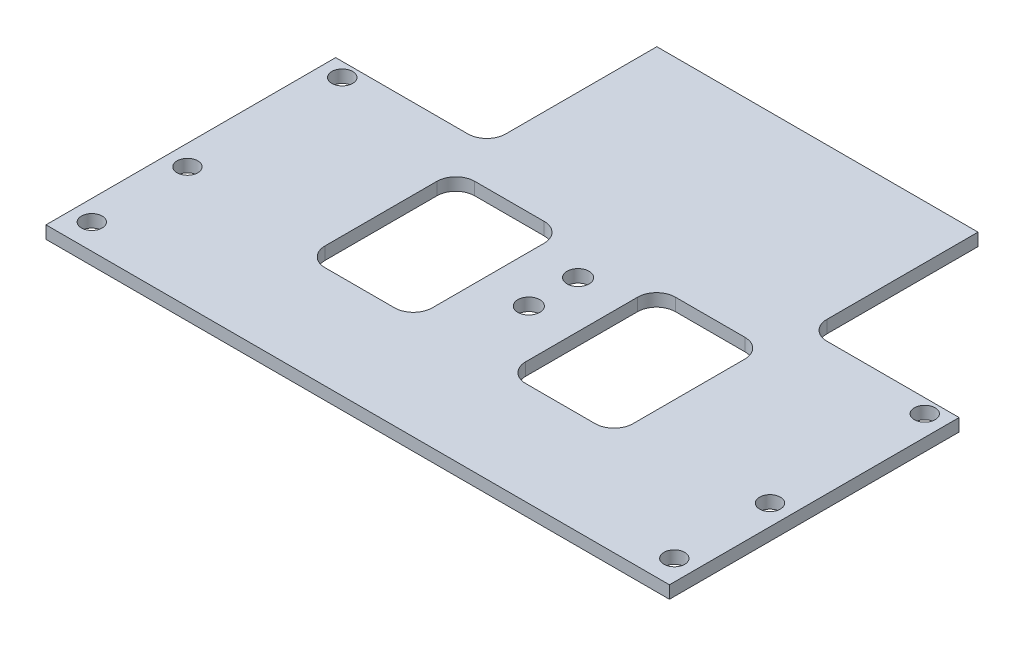
ISO-10303-21;
HEADER;
FILE_DESCRIPTION(('STEP AP214'),'2;1');
FILE_NAME('part.step','',(''),(''),'','','');
FILE_SCHEMA(('AUTOMOTIVE_DESIGN { 1 0 10303 214 1 1 1 1 }'));
ENDSEC;
DATA;
#1=APPLICATION_CONTEXT('core data for automotive mechanical design processes');
#2=APPLICATION_PROTOCOL_DEFINITION('international standard','automotive_design',2000,#1);
#3=PRODUCT_CONTEXT('',#1,'mechanical');
#4=PRODUCT('Part','Part','',(#3));
#5=PRODUCT_RELATED_PRODUCT_CATEGORY('part','',(#4));
#6=PRODUCT_DEFINITION_FORMATION('','',#4);
#7=PRODUCT_DEFINITION_CONTEXT('part definition',#1,'design');
#8=PRODUCT_DEFINITION('design','',#6,#7);
#9=PRODUCT_DEFINITION_SHAPE('','',#8);
#10=(LENGTH_UNIT() NAMED_UNIT(*) SI_UNIT(.MILLI.,.METRE.));
#11=(NAMED_UNIT(*) PLANE_ANGLE_UNIT() SI_UNIT($,.RADIAN.));
#12=(NAMED_UNIT(*) SI_UNIT($,.STERADIAN.) SOLID_ANGLE_UNIT());
#13=UNCERTAINTY_MEASURE_WITH_UNIT(LENGTH_MEASURE(1.E-05),#10,'distance_accuracy_value','');
#14=(GEOMETRIC_REPRESENTATION_CONTEXT(3) GLOBAL_UNCERTAINTY_ASSIGNED_CONTEXT((#13)) GLOBAL_UNIT_ASSIGNED_CONTEXT((#10,
#11,#12)) REPRESENTATION_CONTEXT('',''));
#15=CARTESIAN_POINT('',(0.,0.,0.));
#16=DIRECTION('',(0.,0.,1.));
#17=DIRECTION('',(1.,0.,0.));
#18=AXIS2_PLACEMENT_3D('',#15,#16,#17);
#19=CARTESIAN_POINT('',(0.,2.,-3.53047500057374));
#20=DIRECTION('',(0.,0.,1.));
#21=DIRECTION('',(1.,0.,0.));
#22=AXIS2_PLACEMENT_3D('',#19,#20,#21);
#23=PLANE('',#22);
#24=DIRECTION('',(-1.,0.,0.));
#25=VECTOR('',#24,1.);
#26=CARTESIAN_POINT('',(0.,0.,-3.53047500057374));
#27=LINE('',#26,#25);
#28=CARTESIAN_POINT('',(21.4508414139222,0.,-3.53047500057374));
#29=VERTEX_POINT('',#28);
#30=CARTESIAN_POINT('',(10.4170110272808,0.,-3.53047500057374));
#31=VERTEX_POINT('',#30);
#32=EDGE_CURVE('E355',#29,#31,#27,.T.);
#33=ORIENTED_EDGE('',*,*,#32,.F.);
#34=DIRECTION('',(0.,-1.,0.));
#35=VECTOR('',#34,1.);
#36=CARTESIAN_POINT('',(21.4508414139222,2.,-3.53047500057374));
#37=LINE('',#36,#35);
#38=CARTESIAN_POINT('',(21.4508414139222,2.,-3.53047500057374));
#39=VERTEX_POINT('',#38);
#40=EDGE_CURVE('E11',#39,#29,#37,.T.);
#41=ORIENTED_EDGE('',*,*,#40,.F.);
#42=DIRECTION('',(-1.,0.,0.));
#43=VECTOR('',#42,1.);
#44=CARTESIAN_POINT('',(0.,2.,-3.53047500057374));
#45=LINE('',#44,#43);
#46=CARTESIAN_POINT('',(10.4170110272808,2.,-3.53047500057374));
#47=VERTEX_POINT('',#46);
#48=EDGE_CURVE('E569',#39,#47,#45,.T.);
#49=ORIENTED_EDGE('',*,*,#48,.T.);
#50=DIRECTION('',(0.,-1.,0.));
#51=VECTOR('',#50,1.);
#52=CARTESIAN_POINT('',(10.4170110272808,2.,-3.53047500057374));
#53=LINE('',#52,#51);
#54=EDGE_CURVE('E61',#47,#31,#53,.T.);
#55=ORIENTED_EDGE('',*,*,#54,.T.);
#56=EDGE_LOOP('',(#33,#41,#49,#55));
#57=FACE_BOUND('',#56,.T.);
#58=ADVANCED_FACE('F41',(#57),#23,.T.);
#59=CARTESIAN_POINT('',(21.4508414139222,2.,-0.530475000573742));
#60=DIRECTION('',(0.,-1.,0.));
#61=DIRECTION('',(0.,0.,-1.));
#62=AXIS2_PLACEMENT_3D('',#59,#60,#61);
#63=CYLINDRICAL_SURFACE('',#62,3.);
#64=CARTESIAN_POINT('',(21.4508414139222,0.,-0.530475000573742));
#65=DIRECTION('',(0.,1.,0.));
#66=DIRECTION('',(0.,0.,1.));
#67=AXIS2_PLACEMENT_3D('',#64,#65,#66);
#68=CIRCLE('',#67,3.);
#69=CARTESIAN_POINT('',(24.4508414139222,0.,-0.530475000573721));
#70=VERTEX_POINT('',#69);
#71=EDGE_CURVE('E358',#29,#70,#68,.F.);
#72=ORIENTED_EDGE('',*,*,#71,.T.);
#73=DIRECTION('',(0.,-1.,0.));
#74=VECTOR('',#73,1.);
#75=CARTESIAN_POINT('',(24.4508414139222,2.,-0.530475000573721));
#76=LINE('',#75,#74);
#77=CARTESIAN_POINT('',(24.4508414139222,2.,-0.530475000573721));
#78=VERTEX_POINT('',#77);
#79=EDGE_CURVE('E52',#78,#70,#76,.T.);
#80=ORIENTED_EDGE('',*,*,#79,.F.);
#81=CARTESIAN_POINT('',(21.4508414139222,2.,-0.530475000573742));
#82=DIRECTION('',(0.,1.,0.));
#83=DIRECTION('',(0.,0.,1.));
#84=AXIS2_PLACEMENT_3D('',#81,#82,#83);
#85=CIRCLE('',#84,3.);
#86=EDGE_CURVE('E572',#39,#78,#85,.F.);
#87=ORIENTED_EDGE('',*,*,#86,.F.);
#88=ORIENTED_EDGE('',*,*,#40,.T.);
#89=EDGE_LOOP('',(#72,#80,#87,#88));
#90=FACE_BOUND('',#89,.T.);
#91=ADVANCED_FACE('F606',(#90),#63,.F.);
#92=CARTESIAN_POINT('',(24.4508414139222,2.,0.));
#93=DIRECTION('',(1.,0.,0.));
#94=DIRECTION('',(0.,0.,-1.));
#95=AXIS2_PLACEMENT_3D('',#92,#93,#94);
#96=PLANE('',#95);
#97=DIRECTION('',(0.,0.,1.));
#98=VECTOR('',#97,1.);
#99=CARTESIAN_POINT('',(24.4508414139222,0.,0.));
#100=LINE('',#99,#98);
#101=CARTESIAN_POINT('',(24.4508414139222,0.,17.2380293140944));
#102=VERTEX_POINT('',#101);
#103=EDGE_CURVE('E362',#70,#102,#100,.T.);
#104=ORIENTED_EDGE('',*,*,#103,.T.);
#105=DIRECTION('',(0.,-1.,0.));
#106=VECTOR('',#105,1.);
#107=CARTESIAN_POINT('',(24.4508414139222,2.,17.2380293140944));
#108=LINE('',#107,#106);
#109=CARTESIAN_POINT('',(24.4508414139222,2.,17.2380293140944));
#110=VERTEX_POINT('',#109);
#111=EDGE_CURVE('E395',#110,#102,#108,.T.);
#112=ORIENTED_EDGE('',*,*,#111,.F.);
#113=DIRECTION('',(0.,0.,1.));
#114=VECTOR('',#113,1.);
#115=CARTESIAN_POINT('',(24.4508414139222,2.,0.));
#116=LINE('',#115,#114);
#117=EDGE_CURVE('E576',#78,#110,#116,.T.);
#118=ORIENTED_EDGE('',*,*,#117,.F.);
#119=ORIENTED_EDGE('',*,*,#79,.T.);
#120=EDGE_LOOP('',(#104,#112,#118,#119));
#121=FACE_BOUND('',#120,.T.);
#122=ADVANCED_FACE('F611',(#121),#96,.F.);
#123=CARTESIAN_POINT('',(21.4508414139222,2.,17.2380293140945));
#124=DIRECTION('',(0.,-1.,0.));
#125=DIRECTION('',(0.,0.,-1.));
#126=AXIS2_PLACEMENT_3D('',#123,#124,#125);
#127=CYLINDRICAL_SURFACE('',#126,3.);
#128=CARTESIAN_POINT('',(21.4508414139222,0.,17.2380293140945));
#129=DIRECTION('',(0.,1.,0.));
#130=DIRECTION('',(0.,0.,1.));
#131=AXIS2_PLACEMENT_3D('',#128,#129,#130);
#132=CIRCLE('',#131,3.);
#133=CARTESIAN_POINT('',(21.4508414139222,0.,20.2380293140945));
#134=VERTEX_POINT('',#133);
#135=EDGE_CURVE('E366',#102,#134,#132,.F.);
#136=ORIENTED_EDGE('',*,*,#135,.T.);
#137=DIRECTION('',(0.,-1.,0.));
#138=VECTOR('',#137,1.);
#139=CARTESIAN_POINT('',(21.4508414139222,2.,20.2380293140945));
#140=LINE('',#139,#138);
#141=CARTESIAN_POINT('',(21.4508414139222,2.,20.2380293140945));
#142=VERTEX_POINT('',#141);
#143=EDGE_CURVE('E391',#142,#134,#140,.T.);
#144=ORIENTED_EDGE('',*,*,#143,.F.);
#145=CARTESIAN_POINT('',(21.4508414139222,2.,17.2380293140945));
#146=DIRECTION('',(0.,1.,0.));
#147=DIRECTION('',(0.,0.,1.));
#148=AXIS2_PLACEMENT_3D('',#145,#146,#147);
#149=CIRCLE('',#148,3.);
#150=EDGE_CURVE('E580',#110,#142,#149,.F.);
#151=ORIENTED_EDGE('',*,*,#150,.F.);
#152=ORIENTED_EDGE('',*,*,#111,.T.);
#153=EDGE_LOOP('',(#136,#144,#151,#152));
#154=FACE_BOUND('',#153,.T.);
#155=ADVANCED_FACE('F586',(#154),#127,.F.);
#156=CARTESIAN_POINT('',(0.,2.,20.2380293140945));
#157=DIRECTION('',(0.,0.,1.));
#158=DIRECTION('',(1.,0.,0.));
#159=AXIS2_PLACEMENT_3D('',#156,#157,#158);
#160=PLANE('',#159);
#161=DIRECTION('',(-1.,0.,0.));
#162=VECTOR('',#161,1.);
#163=CARTESIAN_POINT('',(0.,0.,20.2380293140945));
#164=LINE('',#163,#162);
#165=CARTESIAN_POINT('',(10.4170110272808,0.,20.2380293140945));
#166=VERTEX_POINT('',#165);
#167=EDGE_CURVE('E370',#134,#166,#164,.T.);
#168=ORIENTED_EDGE('',*,*,#167,.T.);
#169=DIRECTION('',(0.,-1.,0.));
#170=VECTOR('',#169,1.);
#171=CARTESIAN_POINT('',(10.4170110272808,2.,20.2380293140945));
#172=LINE('',#171,#170);
#173=CARTESIAN_POINT('',(10.4170110272808,2.,20.2380293140945));
#174=VERTEX_POINT('',#173);
#175=EDGE_CURVE('E232',#174,#166,#172,.T.);
#176=ORIENTED_EDGE('',*,*,#175,.F.);
#177=DIRECTION('',(-1.,0.,0.));
#178=VECTOR('',#177,1.);
#179=CARTESIAN_POINT('',(0.,2.,20.2380293140945));
#180=LINE('',#179,#178);
#181=EDGE_CURVE('E241',#142,#174,#180,.T.);
#182=ORIENTED_EDGE('',*,*,#181,.F.);
#183=ORIENTED_EDGE('',*,*,#143,.T.);
#184=EDGE_LOOP('',(#168,#176,#182,#183));
#185=FACE_BOUND('',#184,.T.);
#186=ADVANCED_FACE('F588',(#185),#160,.F.);
#187=CARTESIAN_POINT('',(10.4170110272808,2.,17.2380293140945));
#188=DIRECTION('',(0.,-1.,0.));
#189=DIRECTION('',(0.,0.,-1.));
#190=AXIS2_PLACEMENT_3D('',#187,#188,#189);
#191=CYLINDRICAL_SURFACE('',#190,3.);
#192=CARTESIAN_POINT('',(10.4170110272808,0.,17.2380293140945));
#193=DIRECTION('',(0.,1.,0.));
#194=DIRECTION('',(0.,0.,1.));
#195=AXIS2_PLACEMENT_3D('',#192,#193,#194);
#196=CIRCLE('',#195,3.);
#197=CARTESIAN_POINT('',(7.41701102728081,0.,17.2380293140944));
#198=VERTEX_POINT('',#197);
#199=EDGE_CURVE('E227',#198,#166,#196,.T.);
#200=ORIENTED_EDGE('',*,*,#199,.F.);
#201=DIRECTION('',(0.,-1.,0.));
#202=VECTOR('',#201,1.);
#203=CARTESIAN_POINT('',(7.41701102728081,2.,17.2380293140944));
#204=LINE('',#203,#202);
#205=CARTESIAN_POINT('',(7.41701102728081,2.,17.2380293140944));
#206=VERTEX_POINT('',#205);
#207=EDGE_CURVE('E222',#206,#198,#204,.T.);
#208=ORIENTED_EDGE('',*,*,#207,.F.);
#209=CARTESIAN_POINT('',(10.4170110272808,2.,17.2380293140945));
#210=DIRECTION('',(0.,1.,0.));
#211=DIRECTION('',(0.,0.,1.));
#212=AXIS2_PLACEMENT_3D('',#209,#210,#211);
#213=CIRCLE('',#212,3.);
#214=EDGE_CURVE('E225',#206,#174,#213,.T.);
#215=ORIENTED_EDGE('',*,*,#214,.T.);
#216=ORIENTED_EDGE('',*,*,#175,.T.);
#217=EDGE_LOOP('',(#200,#208,#215,#216));
#218=FACE_BOUND('',#217,.T.);
#219=ADVANCED_FACE('F224',(#218),#191,.F.);
#220=CARTESIAN_POINT('',(7.41701102728081,2.,0.));
#221=DIRECTION('',(1.,0.,0.));
#222=DIRECTION('',(0.,0.,-1.));
#223=AXIS2_PLACEMENT_3D('',#220,#221,#222);
#224=PLANE('',#223);
#225=DIRECTION('',(0.,0.,1.));
#226=VECTOR('',#225,1.);
#227=CARTESIAN_POINT('',(7.41701102728081,0.,0.));
#228=LINE('',#227,#226);
#229=CARTESIAN_POINT('',(7.41701102728081,0.,-0.530475000573721));
#230=VERTEX_POINT('',#229);
#231=EDGE_CURVE('E376',#230,#198,#228,.T.);
#232=ORIENTED_EDGE('',*,*,#231,.F.);
#233=DIRECTION('',(0.,-1.,0.));
#234=VECTOR('',#233,1.);
#235=CARTESIAN_POINT('',(7.41701102728081,2.,-0.530475000573721));
#236=LINE('',#235,#234);
#237=CARTESIAN_POINT('',(7.41701102728081,2.,-0.530475000573721));
#238=VERTEX_POINT('',#237);
#239=EDGE_CURVE('E140',#238,#230,#236,.T.);
#240=ORIENTED_EDGE('',*,*,#239,.F.);
#241=DIRECTION('',(0.,0.,1.));
#242=VECTOR('',#241,1.);
#243=CARTESIAN_POINT('',(7.41701102728081,2.,0.));
#244=LINE('',#243,#242);
#245=EDGE_CURVE('E239',#238,#206,#244,.T.);
#246=ORIENTED_EDGE('',*,*,#245,.T.);
#247=ORIENTED_EDGE('',*,*,#207,.T.);
#248=EDGE_LOOP('',(#232,#240,#246,#247));
#249=FACE_BOUND('',#248,.T.);
#250=ADVANCED_FACE('F245',(#249),#224,.T.);
#251=CARTESIAN_POINT('',(28.5,2.,-12.5));
#252=DIRECTION('',(0.,-1.,0.));
#253=DIRECTION('',(0.,0.,-1.));
#254=AXIS2_PLACEMENT_3D('',#251,#252,#253);
#255=CYLINDRICAL_SURFACE('',#254,3.);
#256=CARTESIAN_POINT('',(28.5,0.,-12.5));
#257=DIRECTION('',(0.,1.,0.));
#258=DIRECTION('',(0.,0.,1.));
#259=AXIS2_PLACEMENT_3D('',#256,#257,#258);
#260=CIRCLE('',#259,3.);
#261=CARTESIAN_POINT('',(25.5,0.,-12.5));
#262=VERTEX_POINT('',#261);
#263=CARTESIAN_POINT('',(28.5,0.,-9.5));
#264=VERTEX_POINT('',#263);
#265=EDGE_CURVE('E283',#262,#264,#260,.T.);
#266=ORIENTED_EDGE('',*,*,#265,.F.);
#267=DIRECTION('',(0.,-1.,0.));
#268=VECTOR('',#267,1.);
#269=CARTESIAN_POINT('',(25.5,2.,-12.5));
#270=LINE('',#269,#268);
#271=CARTESIAN_POINT('',(25.5,2.,-12.5));
#272=VERTEX_POINT('',#271);
#273=EDGE_CURVE('E386',#272,#262,#270,.T.);
#274=ORIENTED_EDGE('',*,*,#273,.F.);
#275=CARTESIAN_POINT('',(28.5,2.,-12.5));
#276=DIRECTION('',(0.,1.,0.));
#277=DIRECTION('',(0.,0.,1.));
#278=AXIS2_PLACEMENT_3D('',#275,#276,#277);
#279=CIRCLE('',#278,3.);
#280=CARTESIAN_POINT('',(28.5,2.,-9.5));
#281=VERTEX_POINT('',#280);
#282=EDGE_CURVE('E501',#272,#281,#279,.T.);
#283=ORIENTED_EDGE('',*,*,#282,.T.);
#284=DIRECTION('',(0.,-1.,0.));
#285=VECTOR('',#284,1.);
#286=CARTESIAN_POINT('',(28.5,2.,-9.5));
#287=LINE('',#286,#285);
#288=EDGE_CURVE('E402',#281,#264,#287,.T.);
#289=ORIENTED_EDGE('',*,*,#288,.T.);
#290=EDGE_LOOP('',(#266,#274,#283,#289));
#291=FACE_BOUND('',#290,.T.);
#292=ADVANCED_FACE('F683',(#291),#255,.F.);
#293=CARTESIAN_POINT('',(25.5,2.,0.));
#294=DIRECTION('',(-1.,0.,0.));
#295=DIRECTION('',(0.,0.,1.));
#296=AXIS2_PLACEMENT_3D('',#293,#294,#295);
#297=PLANE('',#296);
#298=DIRECTION('',(0.,0.,-1.));
#299=VECTOR('',#298,1.);
#300=CARTESIAN_POINT('',(25.5,0.,0.));
#301=LINE('',#300,#299);
#302=CARTESIAN_POINT('',(25.5,0.,-36.5));
#303=VERTEX_POINT('',#302);
#304=EDGE_CURVE('E287',#262,#303,#301,.T.);
#305=ORIENTED_EDGE('',*,*,#304,.T.);
#306=DIRECTION('',(0.,-1.,0.));
#307=VECTOR('',#306,1.);
#308=CARTESIAN_POINT('',(25.5,2.,-36.5));
#309=LINE('',#308,#307);
#310=CARTESIAN_POINT('',(25.5,2.,-36.5));
#311=VERTEX_POINT('',#310);
#312=EDGE_CURVE('E427',#311,#303,#309,.T.);
#313=ORIENTED_EDGE('',*,*,#312,.F.);
#314=DIRECTION('',(0.,0.,-1.));
#315=VECTOR('',#314,1.);
#316=CARTESIAN_POINT('',(25.5,2.,0.));
#317=LINE('',#316,#315);
#318=EDGE_CURVE('E505',#272,#311,#317,.T.);
#319=ORIENTED_EDGE('',*,*,#318,.F.);
#320=ORIENTED_EDGE('',*,*,#273,.T.);
#321=EDGE_LOOP('',(#305,#313,#319,#320));
#322=FACE_BOUND('',#321,.T.);
#323=ADVANCED_FACE('F679',(#322),#297,.F.);
#324=CARTESIAN_POINT('',(0.,2.,-36.5));
#325=DIRECTION('',(0.,0.,-1.));
#326=DIRECTION('',(-1.,0.,0.));
#327=AXIS2_PLACEMENT_3D('',#324,#325,#326);
#328=PLANE('',#327);
#329=DIRECTION('',(1.,0.,0.));
#330=VECTOR('',#329,1.);
#331=CARTESIAN_POINT('',(0.,0.,-36.5));
#332=LINE('',#331,#330);
#333=CARTESIAN_POINT('',(-25.5,0.,-36.5));
#334=VERTEX_POINT('',#333);
#335=EDGE_CURVE('E291',#334,#303,#332,.T.);
#336=ORIENTED_EDGE('',*,*,#335,.F.);
#337=DIRECTION('',(0.,-1.,0.));
#338=VECTOR('',#337,1.);
#339=CARTESIAN_POINT('',(-25.5,2.,-36.5));
#340=LINE('',#339,#338);
#341=CARTESIAN_POINT('',(-25.5,2.,-36.5));
#342=VERTEX_POINT('',#341);
#343=EDGE_CURVE('E424',#342,#334,#340,.T.);
#344=ORIENTED_EDGE('',*,*,#343,.F.);
#345=DIRECTION('',(1.,0.,0.));
#346=VECTOR('',#345,1.);
#347=CARTESIAN_POINT('',(0.,2.,-36.5));
#348=LINE('',#347,#346);
#349=EDGE_CURVE('E508',#342,#311,#348,.T.);
#350=ORIENTED_EDGE('',*,*,#349,.T.);
#351=ORIENTED_EDGE('',*,*,#312,.T.);
#352=EDGE_LOOP('',(#336,#344,#350,#351));
#353=FACE_BOUND('',#352,.T.);
#354=ADVANCED_FACE('F675',(#353),#328,.T.);
#355=CARTESIAN_POINT('',(-25.5,2.,0.));
#356=DIRECTION('',(-1.,0.,0.));
#357=DIRECTION('',(0.,0.,1.));
#358=AXIS2_PLACEMENT_3D('',#355,#356,#357);
#359=PLANE('',#358);
#360=DIRECTION('',(0.,0.,-1.));
#361=VECTOR('',#360,1.);
#362=CARTESIAN_POINT('',(-25.5,0.,0.));
#363=LINE('',#362,#361);
#364=CARTESIAN_POINT('',(-25.5,0.,-12.5));
#365=VERTEX_POINT('',#364);
#366=EDGE_CURVE('E295',#365,#334,#363,.T.);
#367=ORIENTED_EDGE('',*,*,#366,.F.);
#368=DIRECTION('',(0.,-1.,0.));
#369=VECTOR('',#368,1.);
#370=CARTESIAN_POINT('',(-25.5,2.,-12.5));
#371=LINE('',#370,#369);
#372=CARTESIAN_POINT('',(-25.5,2.,-12.5));
#373=VERTEX_POINT('',#372);
#374=EDGE_CURVE('E421',#373,#365,#371,.T.);
#375=ORIENTED_EDGE('',*,*,#374,.F.);
#376=DIRECTION('',(0.,0.,-1.));
#377=VECTOR('',#376,1.);
#378=CARTESIAN_POINT('',(-25.5,2.,0.));
#379=LINE('',#378,#377);
#380=EDGE_CURVE('E512',#373,#342,#379,.T.);
#381=ORIENTED_EDGE('',*,*,#380,.T.);
#382=ORIENTED_EDGE('',*,*,#343,.T.);
#383=EDGE_LOOP('',(#367,#375,#381,#382));
#384=FACE_BOUND('',#383,.T.);
#385=ADVANCED_FACE('F671',(#384),#359,.T.);
#386=CARTESIAN_POINT('',(-28.5,2.,-12.5));
#387=DIRECTION('',(0.,-1.,0.));
#388=DIRECTION('',(0.,0.,-1.));
#389=AXIS2_PLACEMENT_3D('',#386,#387,#388);
#390=CYLINDRICAL_SURFACE('',#389,3.);
#391=CARTESIAN_POINT('',(-28.5,0.,-12.5));
#392=DIRECTION('',(0.,1.,0.));
#393=DIRECTION('',(0.,0.,1.));
#394=AXIS2_PLACEMENT_3D('',#391,#392,#393);
#395=CIRCLE('',#394,3.);
#396=CARTESIAN_POINT('',(-28.5,0.,-9.5));
#397=VERTEX_POINT('',#396);
#398=EDGE_CURVE('E299',#365,#397,#395,.F.);
#399=ORIENTED_EDGE('',*,*,#398,.T.);
#400=DIRECTION('',(0.,-1.,0.));
#401=VECTOR('',#400,1.);
#402=CARTESIAN_POINT('',(-28.5,2.,-9.5));
#403=LINE('',#402,#401);
#404=CARTESIAN_POINT('',(-28.5,2.,-9.5));
#405=VERTEX_POINT('',#404);
#406=EDGE_CURVE('E418',#405,#397,#403,.T.);
#407=ORIENTED_EDGE('',*,*,#406,.F.);
#408=CARTESIAN_POINT('',(-28.5,2.,-12.5));
#409=DIRECTION('',(0.,1.,0.));
#410=DIRECTION('',(0.,0.,1.));
#411=AXIS2_PLACEMENT_3D('',#408,#409,#410);
#412=CIRCLE('',#411,3.);
#413=EDGE_CURVE('E516',#373,#405,#412,.F.);
#414=ORIENTED_EDGE('',*,*,#413,.F.);
#415=ORIENTED_EDGE('',*,*,#374,.T.);
#416=EDGE_LOOP('',(#399,#407,#414,#415));
#417=FACE_BOUND('',#416,.T.);
#418=ADVANCED_FACE('F667',(#417),#390,.F.);
#419=CARTESIAN_POINT('',(0.,2.,-9.5));
#420=DIRECTION('',(0.,0.,-1.));
#421=DIRECTION('',(-1.,0.,0.));
#422=AXIS2_PLACEMENT_3D('',#419,#420,#421);
#423=PLANE('',#422);
#424=DIRECTION('',(1.,0.,0.));
#425=VECTOR('',#424,1.);
#426=CARTESIAN_POINT('',(0.,0.,-9.5));
#427=LINE('',#426,#425);
#428=CARTESIAN_POINT('',(-49.5,0.,-9.5));
#429=VERTEX_POINT('',#428);
#430=EDGE_CURVE('E303',#429,#397,#427,.T.);
#431=ORIENTED_EDGE('',*,*,#430,.F.);
#432=DIRECTION('',(0.,-1.,0.));
#433=VECTOR('',#432,1.);
#434=CARTESIAN_POINT('',(-49.5,2.,-9.5));
#435=LINE('',#434,#433);
#436=CARTESIAN_POINT('',(-49.5,2.,-9.5));
#437=VERTEX_POINT('',#436);
#438=EDGE_CURVE('E415',#437,#429,#435,.T.);
#439=ORIENTED_EDGE('',*,*,#438,.F.);
#440=DIRECTION('',(1.,0.,0.));
#441=VECTOR('',#440,1.);
#442=CARTESIAN_POINT('',(0.,2.,-9.5));
#443=LINE('',#442,#441);
#444=EDGE_CURVE('E519',#437,#405,#443,.T.);
#445=ORIENTED_EDGE('',*,*,#444,.T.);
#446=ORIENTED_EDGE('',*,*,#406,.T.);
#447=EDGE_LOOP('',(#431,#439,#445,#446));
#448=FACE_BOUND('',#447,.T.);
#449=ADVANCED_FACE('F663',(#448),#423,.T.);
#450=CARTESIAN_POINT('',(-49.5,2.,0.));
#451=DIRECTION('',(1.,0.,0.));
#452=DIRECTION('',(0.,0.,-1.));
#453=AXIS2_PLACEMENT_3D('',#450,#451,#452);
#454=PLANE('',#453);
#455=DIRECTION('',(0.,0.,1.));
#456=VECTOR('',#455,1.);
#457=CARTESIAN_POINT('',(-49.5,0.,0.));
#458=LINE('',#457,#456);
#459=CARTESIAN_POINT('',(-49.5,0.,36.5));
#460=VERTEX_POINT('',#459);
#461=EDGE_CURVE('E307',#429,#460,#458,.T.);
#462=ORIENTED_EDGE('',*,*,#461,.T.);
#463=DIRECTION('',(0.,-1.,0.));
#464=VECTOR('',#463,1.);
#465=CARTESIAN_POINT('',(-49.5,2.,36.5));
#466=LINE('',#465,#464);
#467=CARTESIAN_POINT('',(-49.5,2.,36.5));
#468=VERTEX_POINT('',#467);
#469=EDGE_CURVE('E411',#468,#460,#466,.T.);
#470=ORIENTED_EDGE('',*,*,#469,.F.);
#471=DIRECTION('',(0.,0.,1.));
#472=VECTOR('',#471,1.);
#473=CARTESIAN_POINT('',(-49.5,2.,0.));
#474=LINE('',#473,#472);
#475=EDGE_CURVE('E523',#437,#468,#474,.T.);
#476=ORIENTED_EDGE('',*,*,#475,.F.);
#477=ORIENTED_EDGE('',*,*,#438,.T.);
#478=EDGE_LOOP('',(#462,#470,#476,#477));
#479=FACE_BOUND('',#478,.T.);
#480=ADVANCED_FACE('F659',(#479),#454,.F.);
#481=CARTESIAN_POINT('',(0.,2.,36.5));
#482=DIRECTION('',(0.,0.,-1.));
#483=DIRECTION('',(-1.,0.,0.));
#484=AXIS2_PLACEMENT_3D('',#481,#482,#483);
#485=PLANE('',#484);
#486=DIRECTION('',(1.,0.,0.));
#487=VECTOR('',#486,1.);
#488=CARTESIAN_POINT('',(0.,0.,36.5));
#489=LINE('',#488,#487);
#490=CARTESIAN_POINT('',(49.5,0.,36.5));
#491=VERTEX_POINT('',#490);
#492=EDGE_CURVE('E311',#460,#491,#489,.T.);
#493=ORIENTED_EDGE('',*,*,#492,.T.);
#494=DIRECTION('',(0.,-1.,0.));
#495=VECTOR('',#494,1.);
#496=CARTESIAN_POINT('',(49.5,2.,36.5));
#497=LINE('',#496,#495);
#498=CARTESIAN_POINT('',(49.5,2.,36.5));
#499=VERTEX_POINT('',#498);
#500=EDGE_CURVE('E408',#499,#491,#497,.T.);
#501=ORIENTED_EDGE('',*,*,#500,.F.);
#502=DIRECTION('',(1.,0.,0.));
#503=VECTOR('',#502,1.);
#504=CARTESIAN_POINT('',(0.,2.,36.5));
#505=LINE('',#504,#503);
#506=EDGE_CURVE('E527',#468,#499,#505,.T.);
#507=ORIENTED_EDGE('',*,*,#506,.F.);
#508=ORIENTED_EDGE('',*,*,#469,.T.);
#509=EDGE_LOOP('',(#493,#501,#507,#508));
#510=FACE_BOUND('',#509,.T.);
#511=ADVANCED_FACE('F655',(#510),#485,.F.);
#512=CARTESIAN_POINT('',(49.5,2.,0.));
#513=DIRECTION('',(1.,0.,0.));
#514=DIRECTION('',(0.,0.,-1.));
#515=AXIS2_PLACEMENT_3D('',#512,#513,#514);
#516=PLANE('',#515);
#517=DIRECTION('',(0.,0.,1.));
#518=VECTOR('',#517,1.);
#519=CARTESIAN_POINT('',(49.5,0.,0.));
#520=LINE('',#519,#518);
#521=CARTESIAN_POINT('',(49.5,0.,-9.50000000000001));
#522=VERTEX_POINT('',#521);
#523=EDGE_CURVE('E315',#522,#491,#520,.T.);
#524=ORIENTED_EDGE('',*,*,#523,.F.);
#525=DIRECTION('',(0.,-1.,0.));
#526=VECTOR('',#525,1.);
#527=CARTESIAN_POINT('',(49.5,2.,-9.50000000000001));
#528=LINE('',#527,#526);
#529=CARTESIAN_POINT('',(49.5,2.,-9.50000000000001));
#530=VERTEX_POINT('',#529);
#531=EDGE_CURVE('E405',#530,#522,#528,.T.);
#532=ORIENTED_EDGE('',*,*,#531,.F.);
#533=DIRECTION('',(0.,0.,1.));
#534=VECTOR('',#533,1.);
#535=CARTESIAN_POINT('',(49.5,2.,0.));
#536=LINE('',#535,#534);
#537=EDGE_CURVE('E530',#530,#499,#536,.T.);
#538=ORIENTED_EDGE('',*,*,#537,.T.);
#539=ORIENTED_EDGE('',*,*,#500,.T.);
#540=EDGE_LOOP('',(#524,#532,#538,#539));
#541=FACE_BOUND('',#540,.T.);
#542=ADVANCED_FACE('F652',(#541),#516,.T.);
#543=CARTESIAN_POINT('',(-21.4508414139222,2.,17.2380293140944));
#544=DIRECTION('',(0.,-1.,0.));
#545=DIRECTION('',(0.,0.,-1.));
#546=AXIS2_PLACEMENT_3D('',#543,#544,#545);
#547=CYLINDRICAL_SURFACE('',#546,3.);
#548=CARTESIAN_POINT('',(-21.4508414139222,0.,17.2380293140944));
#549=DIRECTION('',(0.,1.,0.));
#550=DIRECTION('',(0.,0.,1.));
#551=AXIS2_PLACEMENT_3D('',#548,#549,#550);
#552=CIRCLE('',#551,3.);
#553=CARTESIAN_POINT('',(-24.4508414139222,0.,17.2380293140944));
#554=VERTEX_POINT('',#553);
#555=CARTESIAN_POINT('',(-21.4508414139222,0.,20.2380293140944));
#556=VERTEX_POINT('',#555);
#557=EDGE_CURVE('E254',#554,#556,#552,.T.);
#558=ORIENTED_EDGE('',*,*,#557,.F.);
#559=DIRECTION('',(0.,-1.,0.));
#560=VECTOR('',#559,1.);
#561=CARTESIAN_POINT('',(-24.4508414139222,2.,17.2380293140944));
#562=LINE('',#561,#560);
#563=CARTESIAN_POINT('',(-24.4508414139222,2.,17.2380293140944));
#564=VERTEX_POINT('',#563);
#565=EDGE_CURVE('E45',#564,#554,#562,.T.);
#566=ORIENTED_EDGE('',*,*,#565,.F.);
#567=CARTESIAN_POINT('',(-21.4508414139222,2.,17.2380293140944));
#568=DIRECTION('',(0.,1.,0.));
#569=DIRECTION('',(0.,0.,1.));
#570=AXIS2_PLACEMENT_3D('',#567,#568,#569);
#571=CIRCLE('',#570,3.);
#572=CARTESIAN_POINT('',(-21.4508414139222,2.,20.2380293140944));
#573=VERTEX_POINT('',#572);
#574=EDGE_CURVE('E383',#564,#573,#571,.T.);
#575=ORIENTED_EDGE('',*,*,#574,.T.);
#576=DIRECTION('',(0.,-1.,0.));
#577=VECTOR('',#576,1.);
#578=CARTESIAN_POINT('',(-21.4508414139222,2.,20.2380293140944));
#579=LINE('',#578,#577);
#580=EDGE_CURVE('E250',#573,#556,#579,.T.);
#581=ORIENTED_EDGE('',*,*,#580,.T.);
#582=EDGE_LOOP('',(#558,#566,#575,#581));
#583=FACE_BOUND('',#582,.T.);
#584=ADVANCED_FACE('F43',(#583),#547,.F.);
#585=CARTESIAN_POINT('',(-24.4508414139222,2.,0.));
#586=DIRECTION('',(1.,0.,0.));
#587=DIRECTION('',(0.,0.,-1.));
#588=AXIS2_PLACEMENT_3D('',#585,#586,#587);
#589=PLANE('',#588);
#590=DIRECTION('',(0.,0.,1.));
#591=VECTOR('',#590,1.);
#592=CARTESIAN_POINT('',(-24.4508414139222,0.,0.));
#593=LINE('',#592,#591);
#594=CARTESIAN_POINT('',(-24.4508414139222,0.,-0.530475000573752));
#595=VERTEX_POINT('',#594);
#596=EDGE_CURVE('E258',#595,#554,#593,.T.);
#597=ORIENTED_EDGE('',*,*,#596,.F.);
#598=DIRECTION('',(0.,-1.,0.));
#599=VECTOR('',#598,1.);
#600=CARTESIAN_POINT('',(-24.4508414139222,2.,-0.530475000573752));
#601=LINE('',#600,#599);
#602=CARTESIAN_POINT('',(-24.4508414139222,2.,-0.530475000573752));
#603=VERTEX_POINT('',#602);
#604=EDGE_CURVE('E451',#603,#595,#601,.T.);
#605=ORIENTED_EDGE('',*,*,#604,.F.);
#606=DIRECTION('',(0.,0.,1.));
#607=VECTOR('',#606,1.);
#608=CARTESIAN_POINT('',(-24.4508414139222,2.,0.));
#609=LINE('',#608,#607);
#610=EDGE_CURVE('E462',#603,#564,#609,.T.);
#611=ORIENTED_EDGE('',*,*,#610,.T.);
#612=ORIENTED_EDGE('',*,*,#565,.T.);
#613=EDGE_LOOP('',(#597,#605,#611,#612));
#614=FACE_BOUND('',#613,.T.);
#615=ADVANCED_FACE('F460',(#614),#589,.T.);
#616=CARTESIAN_POINT('',(-21.4508414139222,2.,-0.53047500057377));
#617=DIRECTION('',(0.,-1.,0.));
#618=DIRECTION('',(0.,0.,-1.));
#619=AXIS2_PLACEMENT_3D('',#616,#617,#618);
#620=CYLINDRICAL_SURFACE('',#619,3.);
#621=CARTESIAN_POINT('',(-21.4508414139222,0.,-0.53047500057377));
#622=DIRECTION('',(0.,1.,0.));
#623=DIRECTION('',(0.,0.,1.));
#624=AXIS2_PLACEMENT_3D('',#621,#622,#623);
#625=CIRCLE('',#624,3.);
#626=CARTESIAN_POINT('',(-21.4508414139222,0.,-3.53047500057377));
#627=VERTEX_POINT('',#626);
#628=EDGE_CURVE('E262',#627,#595,#625,.T.);
#629=ORIENTED_EDGE('',*,*,#628,.F.);
#630=DIRECTION('',(0.,-1.,0.));
#631=VECTOR('',#630,1.);
#632=CARTESIAN_POINT('',(-21.4508414139222,2.,-3.53047500057377));
#633=LINE('',#632,#631);
#634=CARTESIAN_POINT('',(-21.4508414139222,2.,-3.53047500057377));
#635=VERTEX_POINT('',#634);
#636=EDGE_CURVE('E449',#635,#627,#633,.T.);
#637=ORIENTED_EDGE('',*,*,#636,.F.);
#638=CARTESIAN_POINT('',(-21.4508414139222,2.,-0.53047500057377));
#639=DIRECTION('',(0.,1.,0.));
#640=DIRECTION('',(0.,0.,1.));
#641=AXIS2_PLACEMENT_3D('',#638,#639,#640);
#642=CIRCLE('',#641,3.);
#643=EDGE_CURVE('E472',#635,#603,#642,.T.);
#644=ORIENTED_EDGE('',*,*,#643,.T.);
#645=ORIENTED_EDGE('',*,*,#604,.T.);
#646=EDGE_LOOP('',(#629,#637,#644,#645));
#647=FACE_BOUND('',#646,.T.);
#648=ADVANCED_FACE('F469',(#647),#620,.F.);
#649=CARTESIAN_POINT('',(0.,2.,-3.53047500057374));
#650=DIRECTION('',(0.,0.,-1.));
#651=DIRECTION('',(-1.,0.,0.));
#652=AXIS2_PLACEMENT_3D('',#649,#650,#651);
#653=PLANE('',#652);
#654=DIRECTION('',(1.,0.,0.));
#655=VECTOR('',#654,1.);
#656=CARTESIAN_POINT('',(0.,0.,-3.53047500057374));
#657=LINE('',#656,#655);
#658=CARTESIAN_POINT('',(-10.4170110272808,0.,-3.53047500057375));
#659=VERTEX_POINT('',#658);
#660=EDGE_CURVE('E266',#627,#659,#657,.T.);
#661=ORIENTED_EDGE('',*,*,#660,.T.);
#662=DIRECTION('',(0.,-1.,0.));
#663=VECTOR('',#662,1.);
#664=CARTESIAN_POINT('',(-10.4170110272808,2.,-3.53047500057375));
#665=LINE('',#664,#663);
#666=CARTESIAN_POINT('',(-10.4170110272808,2.,-3.53047500057375));
#667=VERTEX_POINT('',#666);
#668=EDGE_CURVE('E445',#667,#659,#665,.T.);
#669=ORIENTED_EDGE('',*,*,#668,.F.);
#670=DIRECTION('',(1.,0.,0.));
#671=VECTOR('',#670,1.);
#672=CARTESIAN_POINT('',(0.,2.,-3.53047500057374));
#673=LINE('',#672,#671);
#674=EDGE_CURVE('E475',#635,#667,#673,.T.);
#675=ORIENTED_EDGE('',*,*,#674,.F.);
#676=ORIENTED_EDGE('',*,*,#636,.T.);
#677=EDGE_LOOP('',(#661,#669,#675,#676));
#678=FACE_BOUND('',#677,.T.);
#679=ADVANCED_FACE('F476',(#678),#653,.F.);
#680=CARTESIAN_POINT('',(-10.4170110272808,2.,-0.530475000573756));
#681=DIRECTION('',(0.,-1.,0.));
#682=DIRECTION('',(0.,0.,-1.));
#683=AXIS2_PLACEMENT_3D('',#680,#681,#682);
#684=CYLINDRICAL_SURFACE('',#683,3.);
#685=CARTESIAN_POINT('',(-10.4170110272808,0.,-0.530475000573756));
#686=DIRECTION('',(0.,1.,0.));
#687=DIRECTION('',(0.,0.,1.));
#688=AXIS2_PLACEMENT_3D('',#685,#686,#687);
#689=CIRCLE('',#688,3.);
#690=CARTESIAN_POINT('',(-7.4170110272808,0.,-0.53047500057373));
#691=VERTEX_POINT('',#690);
#692=EDGE_CURVE('E269',#659,#691,#689,.F.);
#693=ORIENTED_EDGE('',*,*,#692,.T.);
#694=DIRECTION('',(0.,-1.,0.));
#695=VECTOR('',#694,1.);
#696=CARTESIAN_POINT('',(-7.4170110272808,2.,-0.53047500057373));
#697=LINE('',#696,#695);
#698=CARTESIAN_POINT('',(-7.4170110272808,2.,-0.53047500057373));
#699=VERTEX_POINT('',#698);
#700=EDGE_CURVE('E441',#699,#691,#697,.T.);
#701=ORIENTED_EDGE('',*,*,#700,.F.);
#702=CARTESIAN_POINT('',(-10.4170110272808,2.,-0.530475000573756));
#703=DIRECTION('',(0.,1.,0.));
#704=DIRECTION('',(0.,0.,1.));
#705=AXIS2_PLACEMENT_3D('',#702,#703,#704);
#706=CIRCLE('',#705,3.);
#707=EDGE_CURVE('E480',#667,#699,#706,.F.);
#708=ORIENTED_EDGE('',*,*,#707,.F.);
#709=ORIENTED_EDGE('',*,*,#668,.T.);
#710=EDGE_LOOP('',(#693,#701,#708,#709));
#711=FACE_BOUND('',#710,.T.);
#712=ADVANCED_FACE('F694',(#711),#684,.F.);
#713=CARTESIAN_POINT('',(-7.4170110272808,2.,0.));
#714=DIRECTION('',(1.,0.,0.));
#715=DIRECTION('',(0.,0.,-1.));
#716=AXIS2_PLACEMENT_3D('',#713,#714,#715);
#717=PLANE('',#716);
#718=DIRECTION('',(0.,0.,1.));
#719=VECTOR('',#718,1.);
#720=CARTESIAN_POINT('',(-7.4170110272808,0.,0.));
#721=LINE('',#720,#719);
#722=CARTESIAN_POINT('',(-7.41701102728082,0.,17.2380293140944));
#723=VERTEX_POINT('',#722);
#724=EDGE_CURVE('E272',#691,#723,#721,.T.);
#725=ORIENTED_EDGE('',*,*,#724,.T.);
#726=DIRECTION('',(0.,-1.,0.));
#727=VECTOR('',#726,1.);
#728=CARTESIAN_POINT('',(-7.41701102728082,2.,17.2380293140944));
#729=LINE('',#728,#727);
#730=CARTESIAN_POINT('',(-7.41701102728082,2.,17.2380293140944));
#731=VERTEX_POINT('',#730);
#732=EDGE_CURVE('E437',#731,#723,#729,.T.);
#733=ORIENTED_EDGE('',*,*,#732,.F.);
#734=DIRECTION('',(0.,0.,1.));
#735=VECTOR('',#734,1.);
#736=CARTESIAN_POINT('',(-7.4170110272808,2.,0.));
#737=LINE('',#736,#735);
#738=EDGE_CURVE('E491',#699,#731,#737,.T.);
#739=ORIENTED_EDGE('',*,*,#738,.F.);
#740=ORIENTED_EDGE('',*,*,#700,.T.);
#741=EDGE_LOOP('',(#725,#733,#739,#740));
#742=FACE_BOUND('',#741,.T.);
#743=ADVANCED_FACE('F690',(#742),#717,.F.);
#744=CARTESIAN_POINT('',(-10.4170110272808,2.,17.2380293140944));
#745=DIRECTION('',(0.,-1.,0.));
#746=DIRECTION('',(0.,0.,-1.));
#747=AXIS2_PLACEMENT_3D('',#744,#745,#746);
#748=CYLINDRICAL_SURFACE('',#747,3.);
#749=CARTESIAN_POINT('',(-10.4170110272808,0.,17.2380293140944));
#750=DIRECTION('',(0.,1.,0.));
#751=DIRECTION('',(0.,0.,1.));
#752=AXIS2_PLACEMENT_3D('',#749,#750,#751);
#753=CIRCLE('',#752,3.);
#754=CARTESIAN_POINT('',(-10.4170110272808,0.,20.2380293140944));
#755=VERTEX_POINT('',#754);
#756=EDGE_CURVE('E275',#723,#755,#753,.F.);
#757=ORIENTED_EDGE('',*,*,#756,.T.);
#758=DIRECTION('',(0.,-1.,0.));
#759=VECTOR('',#758,1.);
#760=CARTESIAN_POINT('',(-10.4170110272808,2.,20.2380293140944));
#761=LINE('',#760,#759);
#762=CARTESIAN_POINT('',(-10.4170110272808,2.,20.2380293140944));
#763=VERTEX_POINT('',#762);
#764=EDGE_CURVE('E434',#763,#755,#761,.T.);
#765=ORIENTED_EDGE('',*,*,#764,.F.);
#766=CARTESIAN_POINT('',(-10.4170110272808,2.,17.2380293140944));
#767=DIRECTION('',(0.,1.,0.));
#768=DIRECTION('',(0.,0.,1.));
#769=AXIS2_PLACEMENT_3D('',#766,#767,#768);
#770=CIRCLE('',#769,3.);
#771=EDGE_CURVE('E494',#731,#763,#770,.F.);
#772=ORIENTED_EDGE('',*,*,#771,.F.);
#773=ORIENTED_EDGE('',*,*,#732,.T.);
#774=EDGE_LOOP('',(#757,#765,#772,#773));
#775=FACE_BOUND('',#774,.T.);
#776=ADVANCED_FACE('F620',(#775),#748,.F.);
#777=CARTESIAN_POINT('',(-46.2500000000003,2.,-7.29446335231192));
#778=DIRECTION('',(0.,-1.,0.));
#779=DIRECTION('',(0.,0.,-1.));
#780=AXIS2_PLACEMENT_3D('',#777,#778,#779);
#781=CYLINDRICAL_SURFACE('',#780,1.65);
#782=CARTESIAN_POINT('',(-46.2500000000003,2.,-7.29446335231192));
#783=DIRECTION('',(0.,1.,0.));
#784=DIRECTION('',(0.,0.,1.));
#785=AXIS2_PLACEMENT_3D('',#782,#783,#784);
#786=CIRCLE('',#785,1.65);
#787=CARTESIAN_POINT('',(-46.2500000000003,2.,-5.64446335231192));
#788=VERTEX_POINT('',#787);
#789=EDGE_CURVE('E565',#788,#788,#786,.F.);
#790=ORIENTED_EDGE('',*,*,#789,.F.);
#791=EDGE_LOOP('',(#790));
#792=FACE_BOUND('',#791,.T.);
#793=CARTESIAN_POINT('',(-46.2500000000003,0.,-7.29446335231192));
#794=DIRECTION('',(0.,1.,0.));
#795=DIRECTION('',(0.,0.,1.));
#796=AXIS2_PLACEMENT_3D('',#793,#794,#795);
#797=CIRCLE('',#796,1.65);
#798=CARTESIAN_POINT('',(-46.2500000000003,0.,-5.64446335231192));
#799=VERTEX_POINT('',#798);
#800=EDGE_CURVE('E351',#799,#799,#797,.F.);
#801=ORIENTED_EDGE('',*,*,#800,.T.);
#802=EDGE_LOOP('',(#801));
#803=FACE_BOUND('',#802,.T.);
#804=ADVANCED_FACE('F616',(#792,#803),#781,.F.);
#805=CARTESIAN_POINT('',(-46.2500000000004,2.,17.2861082920564));
#806=DIRECTION('',(0.,-1.,0.));
#807=DIRECTION('',(0.,0.,-1.));
#808=AXIS2_PLACEMENT_3D('',#805,#806,#807);
#809=CYLINDRICAL_SURFACE('',#808,1.65);
#810=CARTESIAN_POINT('',(-46.2500000000004,2.,17.2861082920564));
#811=DIRECTION('',(0.,1.,0.));
#812=DIRECTION('',(0.,0.,1.));
#813=AXIS2_PLACEMENT_3D('',#810,#811,#812);
#814=CIRCLE('',#813,1.65);
#815=CARTESIAN_POINT('',(-46.2500000000004,2.,18.9361082920564));
#816=VERTEX_POINT('',#815);
#817=EDGE_CURVE('E561',#816,#816,#814,.F.);
#818=ORIENTED_EDGE('',*,*,#817,.F.);
#819=EDGE_LOOP('',(#818));
#820=FACE_BOUND('',#819,.T.);
#821=CARTESIAN_POINT('',(-46.2500000000004,0.,17.2861082920564));
#822=DIRECTION('',(0.,1.,0.));
#823=DIRECTION('',(0.,0.,1.));
#824=AXIS2_PLACEMENT_3D('',#821,#822,#823);
#825=CIRCLE('',#824,1.65);
#826=CARTESIAN_POINT('',(-46.2500000000004,0.,18.9361082920564));
#827=VERTEX_POINT('',#826);
#828=EDGE_CURVE('E347',#827,#827,#825,.F.);
#829=ORIENTED_EDGE('',*,*,#828,.T.);
#830=EDGE_LOOP('',(#829));
#831=FACE_BOUND('',#830,.T.);
#832=ADVANCED_FACE('F619',(#820,#831),#809,.F.);
#833=CARTESIAN_POINT('',(46.2500000000004,2.,17.2861082920565));
#834=DIRECTION('',(0.,-1.,0.));
#835=DIRECTION('',(0.,0.,-1.));
#836=AXIS2_PLACEMENT_3D('',#833,#834,#835);
#837=CYLINDRICAL_SURFACE('',#836,1.65);
#838=CARTESIAN_POINT('',(46.2500000000004,2.,17.2861082920565));
#839=DIRECTION('',(0.,1.,0.));
#840=DIRECTION('',(0.,0.,1.));
#841=AXIS2_PLACEMENT_3D('',#838,#839,#840);
#842=CIRCLE('',#841,1.65);
#843=CARTESIAN_POINT('',(46.2500000000004,2.,18.9361082920565));
#844=VERTEX_POINT('',#843);
#845=EDGE_CURVE('E557',#844,#844,#842,.T.);
#846=ORIENTED_EDGE('',*,*,#845,.T.);
#847=EDGE_LOOP('',(#846));
#848=FACE_BOUND('',#847,.T.);
#849=CARTESIAN_POINT('',(46.2500000000004,0.,17.2861082920565));
#850=DIRECTION('',(0.,1.,0.));
#851=DIRECTION('',(0.,0.,1.));
#852=AXIS2_PLACEMENT_3D('',#849,#850,#851);
#853=CIRCLE('',#852,1.65);
#854=CARTESIAN_POINT('',(46.2500000000004,0.,18.9361082920565));
#855=VERTEX_POINT('',#854);
#856=EDGE_CURVE('E343',#855,#855,#853,.T.);
#857=ORIENTED_EDGE('',*,*,#856,.F.);
#858=EDGE_LOOP('',(#857));
#859=FACE_BOUND('',#858,.T.);
#860=ADVANCED_FACE('F624',(#848,#859),#837,.F.);
#861=CARTESIAN_POINT('',(46.2500000000004,2.,32.4742777550529));
#862=DIRECTION('',(0.,-1.,0.));
#863=DIRECTION('',(0.,0.,-1.));
#864=AXIS2_PLACEMENT_3D('',#861,#862,#863);
#865=CYLINDRICAL_SURFACE('',#864,1.65);
#866=CARTESIAN_POINT('',(46.2500000000004,2.,32.4742777550529));
#867=DIRECTION('',(0.,1.,0.));
#868=DIRECTION('',(0.,0.,1.));
#869=AXIS2_PLACEMENT_3D('',#866,#867,#868);
#870=CIRCLE('',#869,1.65);
#871=CARTESIAN_POINT('',(46.2500000000004,2.,34.1242777550529));
#872=VERTEX_POINT('',#871);
#873=EDGE_CURVE('E553',#872,#872,#870,.T.);
#874=ORIENTED_EDGE('',*,*,#873,.T.);
#875=EDGE_LOOP('',(#874));
#876=FACE_BOUND('',#875,.T.);
#877=CARTESIAN_POINT('',(46.2500000000004,0.,32.4742777550529));
#878=DIRECTION('',(0.,1.,0.));
#879=DIRECTION('',(0.,0.,1.));
#880=AXIS2_PLACEMENT_3D('',#877,#878,#879);
#881=CIRCLE('',#880,1.65);
#882=CARTESIAN_POINT('',(46.2500000000004,0.,34.1242777550529));
#883=VERTEX_POINT('',#882);
#884=EDGE_CURVE('E339',#883,#883,#881,.T.);
#885=ORIENTED_EDGE('',*,*,#884,.F.);
#886=EDGE_LOOP('',(#885));
#887=FACE_BOUND('',#886,.T.);
#888=ADVANCED_FACE('F628',(#876,#887),#865,.F.);
#889=CARTESIAN_POINT('',(46.2500000000003,2.,-7.29446335231186));
#890=DIRECTION('',(0.,-1.,0.));
#891=DIRECTION('',(0.,0.,-1.));
#892=AXIS2_PLACEMENT_3D('',#889,#890,#891);
#893=CYLINDRICAL_SURFACE('',#892,1.65);
#894=CARTESIAN_POINT('',(46.2500000000003,2.,-7.29446335231186));
#895=DIRECTION('',(0.,1.,0.));
#896=DIRECTION('',(0.,0.,1.));
#897=AXIS2_PLACEMENT_3D('',#894,#895,#896);
#898=CIRCLE('',#897,1.65);
#899=CARTESIAN_POINT('',(46.2500000000003,2.,-5.64446335231187));
#900=VERTEX_POINT('',#899);
#901=EDGE_CURVE('E549',#900,#900,#898,.T.);
#902=ORIENTED_EDGE('',*,*,#901,.T.);
#903=EDGE_LOOP('',(#902));
#904=FACE_BOUND('',#903,.T.);
#905=CARTESIAN_POINT('',(46.2500000000003,0.,-7.29446335231186));
#906=DIRECTION('',(0.,1.,0.));
#907=DIRECTION('',(0.,0.,1.));
#908=AXIS2_PLACEMENT_3D('',#905,#906,#907);
#909=CIRCLE('',#908,1.65);
#910=CARTESIAN_POINT('',(46.2500000000003,0.,-5.64446335231187));
#911=VERTEX_POINT('',#910);
#912=EDGE_CURVE('E335',#911,#911,#909,.T.);
#913=ORIENTED_EDGE('',*,*,#912,.F.);
#914=EDGE_LOOP('',(#913));
#915=FACE_BOUND('',#914,.T.);
#916=ADVANCED_FACE('F632',(#904,#915),#893,.F.);
#917=CARTESIAN_POINT('',(-7.88016939159167E-13,2.,9.32928548546922));
#918=DIRECTION('',(0.,-1.,0.));
#919=DIRECTION('',(0.,0.,-1.));
#920=AXIS2_PLACEMENT_3D('',#917,#918,#919);
#921=CYLINDRICAL_SURFACE('',#920,1.75);
#922=CARTESIAN_POINT('',(-7.88016939159167E-13,2.,9.32928548546922));
#923=DIRECTION('',(0.,1.,0.));
#924=DIRECTION('',(0.,0.,1.));
#925=AXIS2_PLACEMENT_3D('',#922,#923,#924);
#926=CIRCLE('',#925,1.75);
#927=CARTESIAN_POINT('',(-7.88016939159167E-13,2.,11.0792854854692));
#928=VERTEX_POINT('',#927);
#929=EDGE_CURVE('E545',#928,#928,#926,.T.);
#930=ORIENTED_EDGE('',*,*,#929,.T.);
#931=EDGE_LOOP('',(#930));
#932=FACE_BOUND('',#931,.T.);
#933=CARTESIAN_POINT('',(-7.88016939159167E-13,0.,9.32928548546922));
#934=DIRECTION('',(0.,1.,0.));
#935=DIRECTION('',(0.,0.,1.));
#936=AXIS2_PLACEMENT_3D('',#933,#934,#935);
#937=CIRCLE('',#936,1.75);
#938=CARTESIAN_POINT('',(-7.88016939159167E-13,0.,11.0792854854692));
#939=VERTEX_POINT('',#938);
#940=EDGE_CURVE('E331',#939,#939,#937,.T.);
#941=ORIENTED_EDGE('',*,*,#940,.F.);
#942=EDGE_LOOP('',(#941));
#943=FACE_BOUND('',#942,.T.);
#944=ADVANCED_FACE('F636',(#932,#943),#921,.F.);
#945=CARTESIAN_POINT('',(-7.33373621660486E-13,2.,1.50405140920949));
#946=DIRECTION('',(0.,-1.,0.));
#947=DIRECTION('',(0.,0.,-1.));
#948=AXIS2_PLACEMENT_3D('',#945,#946,#947);
#949=CYLINDRICAL_SURFACE('',#948,1.75);
#950=CARTESIAN_POINT('',(-7.33373621660486E-13,2.,1.50405140920949));
#951=DIRECTION('',(0.,1.,0.));
#952=DIRECTION('',(0.,0.,1.));
#953=AXIS2_PLACEMENT_3D('',#950,#951,#952);
#954=CIRCLE('',#953,1.75);
#955=CARTESIAN_POINT('',(-7.33373621660486E-13,2.,3.25405140920949));
#956=VERTEX_POINT('',#955);
#957=EDGE_CURVE('E541',#956,#956,#954,.T.);
#958=ORIENTED_EDGE('',*,*,#957,.T.);
#959=EDGE_LOOP('',(#958));
#960=FACE_BOUND('',#959,.T.);
#961=CARTESIAN_POINT('',(-7.33373621660486E-13,0.,1.50405140920949));
#962=DIRECTION('',(0.,1.,0.));
#963=DIRECTION('',(0.,0.,1.));
#964=AXIS2_PLACEMENT_3D('',#961,#962,#963);
#965=CIRCLE('',#964,1.75);
#966=CARTESIAN_POINT('',(-7.33373621660486E-13,0.,3.25405140920949));
#967=VERTEX_POINT('',#966);
#968=EDGE_CURVE('E327',#967,#967,#965,.T.);
#969=ORIENTED_EDGE('',*,*,#968,.F.);
#970=EDGE_LOOP('',(#969));
#971=FACE_BOUND('',#970,.T.);
#972=ADVANCED_FACE('F640',(#960,#971),#949,.F.);
#973=CARTESIAN_POINT('',(-46.2500000000005,2.,32.4742777550528));
#974=DIRECTION('',(0.,-1.,0.));
#975=DIRECTION('',(0.,0.,-1.));
#976=AXIS2_PLACEMENT_3D('',#973,#974,#975);
#977=CYLINDRICAL_SURFACE('',#976,1.65);
#978=CARTESIAN_POINT('',(-46.2500000000005,2.,32.4742777550528));
#979=DIRECTION('',(0.,1.,0.));
#980=DIRECTION('',(0.,0.,1.));
#981=AXIS2_PLACEMENT_3D('',#978,#979,#980);
#982=CIRCLE('',#981,1.65);
#983=CARTESIAN_POINT('',(-46.2500000000005,2.,34.1242777550528));
#984=VERTEX_POINT('',#983);
#985=EDGE_CURVE('E537',#984,#984,#982,.F.);
#986=ORIENTED_EDGE('',*,*,#985,.F.);
#987=EDGE_LOOP('',(#986));
#988=FACE_BOUND('',#987,.T.);
#989=CARTESIAN_POINT('',(-46.2500000000005,0.,32.4742777550528));
#990=DIRECTION('',(0.,1.,0.));
#991=DIRECTION('',(0.,0.,1.));
#992=AXIS2_PLACEMENT_3D('',#989,#990,#991);
#993=CIRCLE('',#992,1.65);
#994=CARTESIAN_POINT('',(-46.2500000000005,0.,34.1242777550528));
#995=VERTEX_POINT('',#994);
#996=EDGE_CURVE('E323',#995,#995,#993,.F.);
#997=ORIENTED_EDGE('',*,*,#996,.T.);
#998=EDGE_LOOP('',(#997));
#999=FACE_BOUND('',#998,.T.);
#1000=ADVANCED_FACE('F644',(#988,#999),#977,.F.);
#1001=CARTESIAN_POINT('',(0.,2.,-9.5));
#1002=DIRECTION('',(0.,0.,1.));
#1003=DIRECTION('',(1.,0.,0.));
#1004=AXIS2_PLACEMENT_3D('',#1001,#1002,#1003);
#1005=PLANE('',#1004);
#1006=DIRECTION('',(-1.,0.,0.));
#1007=VECTOR('',#1006,1.);
#1008=CARTESIAN_POINT('',(0.,0.,-9.5));
#1009=LINE('',#1008,#1007);
#1010=EDGE_CURVE('E319',#522,#264,#1009,.T.);
#1011=ORIENTED_EDGE('',*,*,#1010,.T.);
#1012=ORIENTED_EDGE('',*,*,#288,.F.);
#1013=DIRECTION('',(-1.,0.,0.));
#1014=VECTOR('',#1013,1.);
#1015=CARTESIAN_POINT('',(0.,2.,-9.5));
#1016=LINE('',#1015,#1014);
#1017=EDGE_CURVE('E534',#530,#281,#1016,.T.);
#1018=ORIENTED_EDGE('',*,*,#1017,.F.);
#1019=ORIENTED_EDGE('',*,*,#531,.T.);
#1020=EDGE_LOOP('',(#1011,#1012,#1018,#1019));
#1021=FACE_BOUND('',#1020,.T.);
#1022=ADVANCED_FACE('F600',(#1021),#1005,.F.);
#1023=CARTESIAN_POINT('',(0.,2.,20.2380293140945));
#1024=DIRECTION('',(0.,0.,-1.));
#1025=DIRECTION('',(-1.,0.,0.));
#1026=AXIS2_PLACEMENT_3D('',#1023,#1024,#1025);
#1027=PLANE('',#1026);
#1028=DIRECTION('',(1.,0.,0.));
#1029=VECTOR('',#1028,1.);
#1030=CARTESIAN_POINT('',(0.,0.,20.2380293140945));
#1031=LINE('',#1030,#1029);
#1032=EDGE_CURVE('E279',#556,#755,#1031,.T.);
#1033=ORIENTED_EDGE('',*,*,#1032,.F.);
#1034=ORIENTED_EDGE('',*,*,#580,.F.);
#1035=DIRECTION('',(1.,0.,0.));
#1036=VECTOR('',#1035,1.);
#1037=CARTESIAN_POINT('',(0.,2.,20.2380293140945));
#1038=LINE('',#1037,#1036);
#1039=EDGE_CURVE('E497',#573,#763,#1038,.T.);
#1040=ORIENTED_EDGE('',*,*,#1039,.T.);
#1041=ORIENTED_EDGE('',*,*,#764,.T.);
#1042=EDGE_LOOP('',(#1033,#1034,#1040,#1041));
#1043=FACE_BOUND('',#1042,.T.);
#1044=ADVANCED_FACE('F593',(#1043),#1027,.T.);
#1045=CARTESIAN_POINT('',(10.4170110272808,2.,-0.530475000573742));
#1046=DIRECTION('',(0.,-1.,0.));
#1047=DIRECTION('',(0.,0.,-1.));
#1048=AXIS2_PLACEMENT_3D('',#1045,#1046,#1047);
#1049=CYLINDRICAL_SURFACE('',#1048,3.);
#1050=CARTESIAN_POINT('',(10.4170110272808,0.,-0.530475000573742));
#1051=DIRECTION('',(0.,1.,0.));
#1052=DIRECTION('',(0.,0.,1.));
#1053=AXIS2_PLACEMENT_3D('',#1050,#1051,#1052);
#1054=CIRCLE('',#1053,3.);
#1055=EDGE_CURVE('E379',#31,#230,#1054,.T.);
#1056=ORIENTED_EDGE('',*,*,#1055,.F.);
#1057=ORIENTED_EDGE('',*,*,#54,.F.);
#1058=CARTESIAN_POINT('',(10.4170110272808,2.,-0.530475000573742));
#1059=DIRECTION('',(0.,1.,0.));
#1060=DIRECTION('',(0.,0.,1.));
#1061=AXIS2_PLACEMENT_3D('',#1058,#1059,#1060);
#1062=CIRCLE('',#1061,3.);
#1063=EDGE_CURVE('E247',#47,#238,#1062,.T.);
#1064=ORIENTED_EDGE('',*,*,#1063,.T.);
#1065=ORIENTED_EDGE('',*,*,#239,.T.);
#1066=EDGE_LOOP('',(#1056,#1057,#1064,#1065));
#1067=FACE_BOUND('',#1066,.T.);
#1068=ADVANCED_FACE('F591',(#1067),#1049,.F.);
#1069=CARTESIAN_POINT('',(0.,2.,0.));
#1070=DIRECTION('',(0.,1.,0.));
#1071=DIRECTION('',(0.,0.,1.));
#1072=AXIS2_PLACEMENT_3D('',#1069,#1070,#1071);
#1073=PLANE('',#1072);
#1074=ORIENTED_EDGE('',*,*,#574,.F.);
#1075=ORIENTED_EDGE('',*,*,#610,.F.);
#1076=ORIENTED_EDGE('',*,*,#643,.F.);
#1077=ORIENTED_EDGE('',*,*,#674,.T.);
#1078=ORIENTED_EDGE('',*,*,#707,.T.);
#1079=ORIENTED_EDGE('',*,*,#738,.T.);
#1080=ORIENTED_EDGE('',*,*,#771,.T.);
#1081=ORIENTED_EDGE('',*,*,#1039,.F.);
#1082=EDGE_LOOP('',(#1074,#1075,#1076,#1077,#1078,#1079,#1080,#1081));
#1083=FACE_BOUND('',#1082,.T.);
#1084=ORIENTED_EDGE('',*,*,#282,.F.);
#1085=ORIENTED_EDGE('',*,*,#318,.T.);
#1086=ORIENTED_EDGE('',*,*,#349,.F.);
#1087=ORIENTED_EDGE('',*,*,#380,.F.);
#1088=ORIENTED_EDGE('',*,*,#413,.T.);
#1089=ORIENTED_EDGE('',*,*,#444,.F.);
#1090=ORIENTED_EDGE('',*,*,#475,.T.);
#1091=ORIENTED_EDGE('',*,*,#506,.T.);
#1092=ORIENTED_EDGE('',*,*,#537,.F.);
#1093=ORIENTED_EDGE('',*,*,#1017,.T.);
#1094=EDGE_LOOP('',(#1084,#1085,#1086,#1087,#1088,#1089,#1090,#1091,#1092,#1093));
#1095=FACE_BOUND('',#1094,.T.);
#1096=ORIENTED_EDGE('',*,*,#985,.T.);
#1097=EDGE_LOOP('',(#1096));
#1098=FACE_BOUND('',#1097,.T.);
#1099=ORIENTED_EDGE('',*,*,#957,.F.);
#1100=EDGE_LOOP('',(#1099));
#1101=FACE_BOUND('',#1100,.T.);
#1102=ORIENTED_EDGE('',*,*,#929,.F.);
#1103=EDGE_LOOP('',(#1102));
#1104=FACE_BOUND('',#1103,.T.);
#1105=ORIENTED_EDGE('',*,*,#901,.F.);
#1106=EDGE_LOOP('',(#1105));
#1107=FACE_BOUND('',#1106,.T.);
#1108=ORIENTED_EDGE('',*,*,#873,.F.);
#1109=EDGE_LOOP('',(#1108));
#1110=FACE_BOUND('',#1109,.T.);
#1111=ORIENTED_EDGE('',*,*,#845,.F.);
#1112=EDGE_LOOP('',(#1111));
#1113=FACE_BOUND('',#1112,.T.);
#1114=ORIENTED_EDGE('',*,*,#817,.T.);
#1115=EDGE_LOOP('',(#1114));
#1116=FACE_BOUND('',#1115,.T.);
#1117=ORIENTED_EDGE('',*,*,#789,.T.);
#1118=EDGE_LOOP('',(#1117));
#1119=FACE_BOUND('',#1118,.T.);
#1120=ORIENTED_EDGE('',*,*,#48,.F.);
#1121=ORIENTED_EDGE('',*,*,#86,.T.);
#1122=ORIENTED_EDGE('',*,*,#117,.T.);
#1123=ORIENTED_EDGE('',*,*,#150,.T.);
#1124=ORIENTED_EDGE('',*,*,#181,.T.);
#1125=ORIENTED_EDGE('',*,*,#214,.F.);
#1126=ORIENTED_EDGE('',*,*,#245,.F.);
#1127=ORIENTED_EDGE('',*,*,#1063,.F.);
#1128=EDGE_LOOP('',(#1120,#1121,#1122,#1123,#1124,#1125,#1126,#1127));
#1129=FACE_BOUND('',#1128,.T.);
#1130=ADVANCED_FACE('F237',(#1083,#1095,#1098,#1101,#1104,#1107,#1110,#1113,#1116,#1119,#1129),
#1073,.T.);
#1131=CARTESIAN_POINT('',(0.,0.,0.));
#1132=DIRECTION('',(0.,1.,0.));
#1133=DIRECTION('',(0.,0.,1.));
#1134=AXIS2_PLACEMENT_3D('',#1131,#1132,#1133);
#1135=PLANE('',#1134);
#1136=ORIENTED_EDGE('',*,*,#557,.T.);
#1137=ORIENTED_EDGE('',*,*,#1032,.T.);
#1138=ORIENTED_EDGE('',*,*,#756,.F.);
#1139=ORIENTED_EDGE('',*,*,#724,.F.);
#1140=ORIENTED_EDGE('',*,*,#692,.F.);
#1141=ORIENTED_EDGE('',*,*,#660,.F.);
#1142=ORIENTED_EDGE('',*,*,#628,.T.);
#1143=ORIENTED_EDGE('',*,*,#596,.T.);
#1144=EDGE_LOOP('',(#1136,#1137,#1138,#1139,#1140,#1141,#1142,#1143));
#1145=FACE_BOUND('',#1144,.T.);
#1146=ORIENTED_EDGE('',*,*,#265,.T.);
#1147=ORIENTED_EDGE('',*,*,#1010,.F.);
#1148=ORIENTED_EDGE('',*,*,#523,.T.);
#1149=ORIENTED_EDGE('',*,*,#492,.F.);
#1150=ORIENTED_EDGE('',*,*,#461,.F.);
#1151=ORIENTED_EDGE('',*,*,#430,.T.);
#1152=ORIENTED_EDGE('',*,*,#398,.F.);
#1153=ORIENTED_EDGE('',*,*,#366,.T.);
#1154=ORIENTED_EDGE('',*,*,#335,.T.);
#1155=ORIENTED_EDGE('',*,*,#304,.F.);
#1156=EDGE_LOOP('',(#1146,#1147,#1148,#1149,#1150,#1151,#1152,#1153,#1154,#1155));
#1157=FACE_BOUND('',#1156,.T.);
#1158=ORIENTED_EDGE('',*,*,#996,.F.);
#1159=EDGE_LOOP('',(#1158));
#1160=FACE_BOUND('',#1159,.T.);
#1161=ORIENTED_EDGE('',*,*,#968,.T.);
#1162=EDGE_LOOP('',(#1161));
#1163=FACE_BOUND('',#1162,.T.);
#1164=ORIENTED_EDGE('',*,*,#940,.T.);
#1165=EDGE_LOOP('',(#1164));
#1166=FACE_BOUND('',#1165,.T.);
#1167=ORIENTED_EDGE('',*,*,#912,.T.);
#1168=EDGE_LOOP('',(#1167));
#1169=FACE_BOUND('',#1168,.T.);
#1170=ORIENTED_EDGE('',*,*,#884,.T.);
#1171=EDGE_LOOP('',(#1170));
#1172=FACE_BOUND('',#1171,.T.);
#1173=ORIENTED_EDGE('',*,*,#856,.T.);
#1174=EDGE_LOOP('',(#1173));
#1175=FACE_BOUND('',#1174,.T.);
#1176=ORIENTED_EDGE('',*,*,#828,.F.);
#1177=EDGE_LOOP('',(#1176));
#1178=FACE_BOUND('',#1177,.T.);
#1179=ORIENTED_EDGE('',*,*,#800,.F.);
#1180=EDGE_LOOP('',(#1179));
#1181=FACE_BOUND('',#1180,.T.);
#1182=ORIENTED_EDGE('',*,*,#32,.T.);
#1183=ORIENTED_EDGE('',*,*,#1055,.T.);
#1184=ORIENTED_EDGE('',*,*,#231,.T.);
#1185=ORIENTED_EDGE('',*,*,#199,.T.);
#1186=ORIENTED_EDGE('',*,*,#167,.F.);
#1187=ORIENTED_EDGE('',*,*,#135,.F.);
#1188=ORIENTED_EDGE('',*,*,#103,.F.);
#1189=ORIENTED_EDGE('',*,*,#71,.F.);
#1190=EDGE_LOOP('',(#1182,#1183,#1184,#1185,#1186,#1187,#1188,#1189));
#1191=FACE_BOUND('',#1190,.T.);
#1192=ADVANCED_FACE('F465',(#1145,#1157,#1160,#1163,#1166,#1169,#1172,#1175,#1178,#1181,#1191),
#1135,.F.);
#1193=CLOSED_SHELL('',(#58,#91,#122,#155,#186,#219,#250,#292,#323,#354,#385,#418,#449,#480,#511,
#542,#584,#615,#648,#679,#712,#743,#776,#804,#832,#860,#888,#916,#944,#972,#1000,#1022,#1044,
#1068,#1130,#1192));
#1194=MANIFOLD_SOLID_BREP('B2',#1193);
#1195=ADVANCED_BREP_SHAPE_REPRESENTATION('',(#18,#1194),#14);
#1196=SHAPE_DEFINITION_REPRESENTATION(#9,#1195);
ENDSEC;
END-ISO-10303-21;
